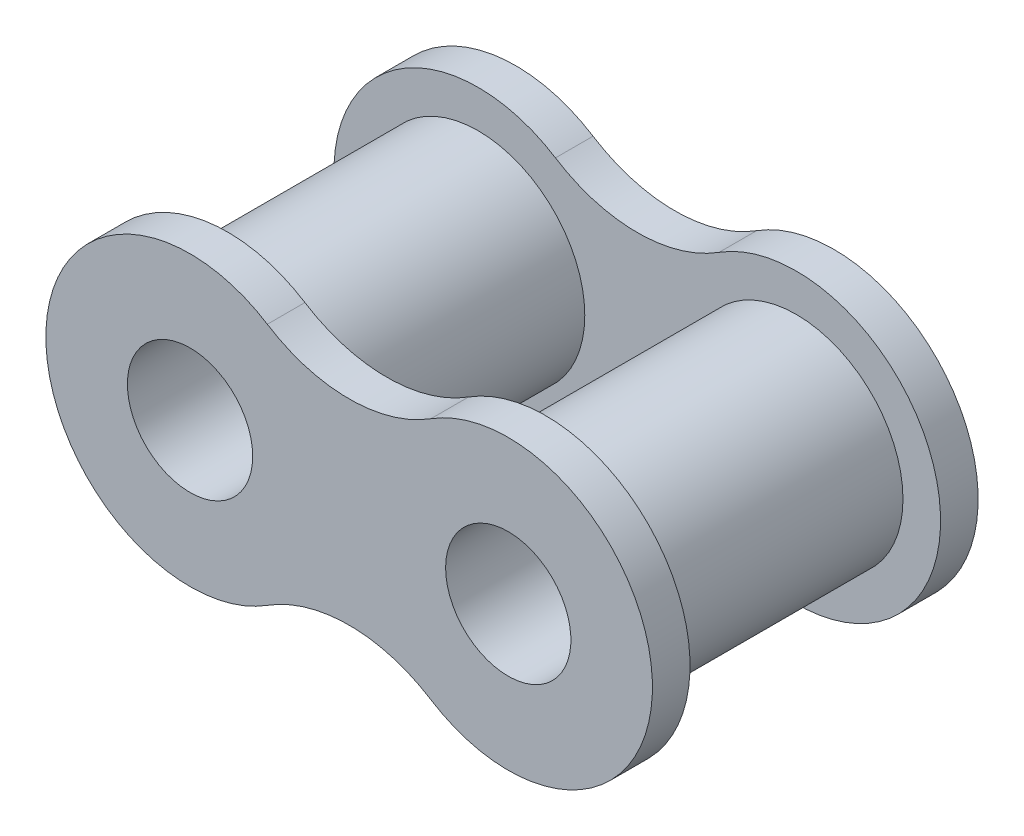
ISO-10303-21;
HEADER;
FILE_DESCRIPTION(('STEP AP214'),'2;1');
FILE_NAME('part.step','',(''),(''),'','','');
FILE_SCHEMA(('AUTOMOTIVE_DESIGN { 1 0 10303 214 1 1 1 1 }'));
ENDSEC;
DATA;
#1=APPLICATION_CONTEXT('core data for automotive mechanical design processes');
#2=APPLICATION_PROTOCOL_DEFINITION('international standard','automotive_design',2000,#1);
#3=PRODUCT_CONTEXT('',#1,'mechanical');
#4=PRODUCT('Part','Part','',(#3));
#5=PRODUCT_RELATED_PRODUCT_CATEGORY('part','',(#4));
#6=PRODUCT_DEFINITION_FORMATION('','',#4);
#7=PRODUCT_DEFINITION_CONTEXT('part definition',#1,'design');
#8=PRODUCT_DEFINITION('design','',#6,#7);
#9=PRODUCT_DEFINITION_SHAPE('','',#8);
#10=(LENGTH_UNIT() NAMED_UNIT(*) SI_UNIT(.MILLI.,.METRE.));
#11=(NAMED_UNIT(*) PLANE_ANGLE_UNIT() SI_UNIT($,.RADIAN.));
#12=(NAMED_UNIT(*) SI_UNIT($,.STERADIAN.) SOLID_ANGLE_UNIT());
#13=UNCERTAINTY_MEASURE_WITH_UNIT(LENGTH_MEASURE(1.E-05),#10,'distance_accuracy_value','');
#14=(GEOMETRIC_REPRESENTATION_CONTEXT(3) GLOBAL_UNCERTAINTY_ASSIGNED_CONTEXT((#13)) GLOBAL_UNIT_ASSIGNED_CONTEXT((#10,
#11,#12)) REPRESENTATION_CONTEXT('',''));
#15=CARTESIAN_POINT('',(0.,0.,0.));
#16=DIRECTION('',(0.,0.,1.));
#17=DIRECTION('',(1.,0.,0.));
#18=AXIS2_PLACEMENT_3D('',#15,#16,#17);
#19=CARTESIAN_POINT('',(3.175,5.,-5.));
#20=DIRECTION('',(0.,0.,1.));
#21=DIRECTION('',(1.,0.,0.));
#22=AXIS2_PLACEMENT_3D('',#19,#20,#21);
#23=PLANE('',#22);
#24=CARTESIAN_POINT('',(0.,10.,-5.));
#25=DIRECTION('',(0.,0.,1.));
#26=DIRECTION('',(1.,0.,0.));
#27=AXIS2_PLACEMENT_3D('',#24,#25,#26);
#28=CIRCLE('',#27,6.09077983925077);
#29=CARTESIAN_POINT('',(-3.26499837951476,4.85827026848069,-5.));
#30=VERTEX_POINT('',#29);
#31=CARTESIAN_POINT('',(3.26499837951476,4.85827026848069,-5.));
#32=VERTEX_POINT('',#31);
#33=EDGE_CURVE('E159',#30,#32,#28,.T.);
#34=ORIENTED_EDGE('',*,*,#33,.F.);
#35=CARTESIAN_POINT('',(-6.35,0.,-5.));
#36=DIRECTION('',(0.,0.,1.));
#37=DIRECTION('',(1.,0.,0.));
#38=AXIS2_PLACEMENT_3D('',#35,#36,#37);
#39=CIRCLE('',#38,5.755);
#40=CARTESIAN_POINT('',(-3.26499837951476,-4.85827026848069,-5.));
#41=VERTEX_POINT('',#40);
#42=EDGE_CURVE('E164',#30,#41,#39,.T.);
#43=ORIENTED_EDGE('',*,*,#42,.T.);
#44=CARTESIAN_POINT('',(0.,-10.,-5.));
#45=DIRECTION('',(0.,0.,-1.));
#46=DIRECTION('',(-1.,0.,0.));
#47=AXIS2_PLACEMENT_3D('',#44,#45,#46);
#48=CIRCLE('',#47,6.09077983925077);
#49=CARTESIAN_POINT('',(3.26499837951476,-4.85827026848069,-5.));
#50=VERTEX_POINT('',#49);
#51=EDGE_CURVE('E175',#41,#50,#48,.T.);
#52=ORIENTED_EDGE('',*,*,#51,.T.);
#53=CARTESIAN_POINT('',(6.35,0.,-5.));
#54=DIRECTION('',(0.,0.,-1.));
#55=DIRECTION('',(-1.,0.,0.));
#56=AXIS2_PLACEMENT_3D('',#53,#54,#55);
#57=CIRCLE('',#56,5.755);
#58=EDGE_CURVE('E172',#32,#50,#57,.T.);
#59=ORIENTED_EDGE('',*,*,#58,.F.);
#60=EDGE_LOOP('',(#34,#43,#52,#59));
#61=FACE_BOUND('',#60,.T.);
#62=CARTESIAN_POINT('',(6.35,0.,-5.));
#63=DIRECTION('',(0.,0.,1.));
#64=DIRECTION('',(1.,0.,0.));
#65=AXIS2_PLACEMENT_3D('',#62,#63,#64);
#66=CIRCLE('',#65,4.255);
#67=CARTESIAN_POINT('',(10.605,0.,-5.));
#68=VERTEX_POINT('',#67);
#69=EDGE_CURVE('E11',#68,#68,#66,.F.);
#70=ORIENTED_EDGE('',*,*,#69,.T.);
#71=EDGE_LOOP('',(#70));
#72=FACE_BOUND('',#71,.T.);
#73=CARTESIAN_POINT('',(-6.35,0.,-5.));
#74=DIRECTION('',(0.,0.,1.));
#75=DIRECTION('',(1.,0.,0.));
#76=AXIS2_PLACEMENT_3D('',#73,#74,#75);
#77=CIRCLE('',#76,4.255);
#78=CARTESIAN_POINT('',(-2.095,0.,-5.));
#79=VERTEX_POINT('',#78);
#80=EDGE_CURVE('E156',#79,#79,#77,.T.);
#81=ORIENTED_EDGE('',*,*,#80,.F.);
#82=EDGE_LOOP('',(#81));
#83=FACE_BOUND('',#82,.T.);
#84=ADVANCED_FACE('F36',(#61,#72,#83),#23,.T.);
#85=CARTESIAN_POINT('',(6.35,0.,5.));
#86=DIRECTION('',(0.,0.,-1.));
#87=DIRECTION('',(-1.,0.,0.));
#88=AXIS2_PLACEMENT_3D('',#85,#86,#87);
#89=CYLINDRICAL_SURFACE('',#88,4.255);
#90=CARTESIAN_POINT('',(6.35,0.,5.));
#91=DIRECTION('',(0.,0.,-1.));
#92=DIRECTION('',(-1.,0.,0.));
#93=AXIS2_PLACEMENT_3D('',#90,#91,#92);
#94=CIRCLE('',#93,4.255);
#95=CARTESIAN_POINT('',(2.095,0.,5.));
#96=VERTEX_POINT('',#95);
#97=EDGE_CURVE('E118',#96,#96,#94,.F.);
#98=ORIENTED_EDGE('',*,*,#97,.F.);
#99=EDGE_LOOP('',(#98));
#100=FACE_BOUND('',#99,.T.);
#101=ORIENTED_EDGE('',*,*,#69,.F.);
#102=EDGE_LOOP('',(#101));
#103=FACE_BOUND('',#102,.T.);
#104=ADVANCED_FACE('F38',(#100,#103),#89,.T.);
#105=CARTESIAN_POINT('',(0.,10.,-6.5));
#106=DIRECTION('',(0.,0.,1.));
#107=DIRECTION('',(1.,0.,0.));
#108=AXIS2_PLACEMENT_3D('',#105,#106,#107);
#109=CYLINDRICAL_SURFACE('',#108,6.09077983925077);
#110=ORIENTED_EDGE('',*,*,#33,.T.);
#111=DIRECTION('',(0.,0.,1.));
#112=VECTOR('',#111,1.);
#113=CARTESIAN_POINT('',(3.26499837951476,4.85827026848069,-6.5));
#114=LINE('',#113,#112);
#115=CARTESIAN_POINT('',(3.26499837951476,4.85827026848069,-6.5));
#116=VERTEX_POINT('',#115);
#117=EDGE_CURVE('E45',#116,#32,#114,.T.);
#118=ORIENTED_EDGE('',*,*,#117,.F.);
#119=CARTESIAN_POINT('',(0.,10.,-6.5));
#120=DIRECTION('',(0.,0.,1.));
#121=DIRECTION('',(1.,0.,0.));
#122=AXIS2_PLACEMENT_3D('',#119,#120,#121);
#123=CIRCLE('',#122,6.09077983925077);
#124=CARTESIAN_POINT('',(-3.26499837951476,4.85827026848069,-6.5));
#125=VERTEX_POINT('',#124);
#126=EDGE_CURVE('E162',#125,#116,#123,.T.);
#127=ORIENTED_EDGE('',*,*,#126,.F.);
#128=DIRECTION('',(0.,0.,1.));
#129=VECTOR('',#128,1.);
#130=CARTESIAN_POINT('',(-3.26499837951476,4.85827026848069,-6.5));
#131=LINE('',#130,#129);
#132=EDGE_CURVE('E53',#125,#30,#131,.T.);
#133=ORIENTED_EDGE('',*,*,#132,.T.);
#134=EDGE_LOOP('',(#110,#118,#127,#133));
#135=FACE_BOUND('',#134,.T.);
#136=ADVANCED_FACE('F185',(#135),#109,.F.);
#137=CARTESIAN_POINT('',(6.35,0.,-6.5));
#138=DIRECTION('',(0.,0.,1.));
#139=DIRECTION('',(1.,0.,0.));
#140=AXIS2_PLACEMENT_3D('',#137,#138,#139);
#141=CYLINDRICAL_SURFACE('',#140,5.755);
#142=ORIENTED_EDGE('',*,*,#58,.T.);
#143=DIRECTION('',(0.,0.,1.));
#144=VECTOR('',#143,1.);
#145=CARTESIAN_POINT('',(3.26499837951476,-4.85827026848069,-6.5));
#146=LINE('',#145,#144);
#147=CARTESIAN_POINT('',(3.26499837951476,-4.85827026848069,-6.5));
#148=VERTEX_POINT('',#147);
#149=EDGE_CURVE('E182',#148,#50,#146,.T.);
#150=ORIENTED_EDGE('',*,*,#149,.F.);
#151=CARTESIAN_POINT('',(6.35,0.,-6.5));
#152=DIRECTION('',(0.,0.,-1.));
#153=DIRECTION('',(-1.,0.,0.));
#154=AXIS2_PLACEMENT_3D('',#151,#152,#153);
#155=CIRCLE('',#154,5.755);
#156=EDGE_CURVE('E80',#116,#148,#155,.T.);
#157=ORIENTED_EDGE('',*,*,#156,.F.);
#158=ORIENTED_EDGE('',*,*,#117,.T.);
#159=EDGE_LOOP('',(#142,#150,#157,#158));
#160=FACE_BOUND('',#159,.T.);
#161=ADVANCED_FACE('F184',(#160),#141,.T.);
#162=CARTESIAN_POINT('',(0.,-10.,-6.5));
#163=DIRECTION('',(0.,0.,1.));
#164=DIRECTION('',(1.,0.,0.));
#165=AXIS2_PLACEMENT_3D('',#162,#163,#164);
#166=CYLINDRICAL_SURFACE('',#165,6.09077983925077);
#167=ORIENTED_EDGE('',*,*,#51,.F.);
#168=DIRECTION('',(0.,0.,1.));
#169=VECTOR('',#168,1.);
#170=CARTESIAN_POINT('',(-3.26499837951476,-4.85827026848069,-6.5));
#171=LINE('',#170,#169);
#172=CARTESIAN_POINT('',(-3.26499837951476,-4.85827026848069,-6.5));
#173=VERTEX_POINT('',#172);
#174=EDGE_CURVE('E68',#173,#41,#171,.T.);
#175=ORIENTED_EDGE('',*,*,#174,.F.);
#176=CARTESIAN_POINT('',(0.,-10.,-6.5));
#177=DIRECTION('',(0.,0.,-1.));
#178=DIRECTION('',(-1.,0.,0.));
#179=AXIS2_PLACEMENT_3D('',#176,#177,#178);
#180=CIRCLE('',#179,6.09077983925077);
#181=EDGE_CURVE('E166',#173,#148,#180,.T.);
#182=ORIENTED_EDGE('',*,*,#181,.T.);
#183=ORIENTED_EDGE('',*,*,#149,.T.);
#184=EDGE_LOOP('',(#167,#175,#182,#183));
#185=FACE_BOUND('',#184,.T.);
#186=ADVANCED_FACE('F191',(#185),#166,.F.);
#187=CARTESIAN_POINT('',(-6.35,0.,-6.5));
#188=DIRECTION('',(0.,0.,1.));
#189=DIRECTION('',(1.,0.,0.));
#190=AXIS2_PLACEMENT_3D('',#187,#188,#189);
#191=CYLINDRICAL_SURFACE('',#190,5.755);
#192=ORIENTED_EDGE('',*,*,#42,.F.);
#193=ORIENTED_EDGE('',*,*,#132,.F.);
#194=CARTESIAN_POINT('',(-6.35,0.,-6.5));
#195=DIRECTION('',(0.,0.,1.));
#196=DIRECTION('',(1.,0.,0.));
#197=AXIS2_PLACEMENT_3D('',#194,#195,#196);
#198=CIRCLE('',#197,5.755);
#199=EDGE_CURVE('E169',#125,#173,#198,.T.);
#200=ORIENTED_EDGE('',*,*,#199,.T.);
#201=ORIENTED_EDGE('',*,*,#174,.T.);
#202=EDGE_LOOP('',(#192,#193,#200,#201));
#203=FACE_BOUND('',#202,.T.);
#204=ADVANCED_FACE('F188',(#203),#191,.T.);
#205=CARTESIAN_POINT('',(3.175,5.,-6.5));
#206=DIRECTION('',(0.,0.,1.));
#207=DIRECTION('',(1.,0.,0.));
#208=AXIS2_PLACEMENT_3D('',#205,#206,#207);
#209=PLANE('',#208);
#210=CARTESIAN_POINT('',(6.35,0.,-6.5));
#211=DIRECTION('',(0.,0.,1.));
#212=DIRECTION('',(-1.,0.,0.));
#213=AXIS2_PLACEMENT_3D('',#210,#211,#212);
#214=CIRCLE('',#213,2.5);
#215=CARTESIAN_POINT('',(3.85,0.,-6.5));
#216=VERTEX_POINT('',#215);
#217=EDGE_CURVE('E243',#216,#216,#214,.T.);
#218=ORIENTED_EDGE('',*,*,#217,.T.);
#219=EDGE_LOOP('',(#218));
#220=FACE_BOUND('',#219,.T.);
#221=CARTESIAN_POINT('',(-6.35,0.,-6.5));
#222=DIRECTION('',(0.,0.,1.));
#223=DIRECTION('',(1.,0.,0.));
#224=AXIS2_PLACEMENT_3D('',#221,#222,#223);
#225=CIRCLE('',#224,2.5);
#226=CARTESIAN_POINT('',(-3.85,0.,-6.5));
#227=VERTEX_POINT('',#226);
#228=EDGE_CURVE('E138',#227,#227,#225,.T.);
#229=ORIENTED_EDGE('',*,*,#228,.T.);
#230=EDGE_LOOP('',(#229));
#231=FACE_BOUND('',#230,.T.);
#232=ORIENTED_EDGE('',*,*,#126,.T.);
#233=ORIENTED_EDGE('',*,*,#156,.T.);
#234=ORIENTED_EDGE('',*,*,#181,.F.);
#235=ORIENTED_EDGE('',*,*,#199,.F.);
#236=EDGE_LOOP('',(#232,#233,#234,#235));
#237=FACE_BOUND('',#236,.T.);
#238=ADVANCED_FACE('F190',(#220,#231,#237),#209,.F.);
#239=CARTESIAN_POINT('',(-6.35,0.,5.));
#240=DIRECTION('',(0.,0.,-1.));
#241=DIRECTION('',(-1.,0.,0.));
#242=AXIS2_PLACEMENT_3D('',#239,#240,#241);
#243=CYLINDRICAL_SURFACE('',#242,4.255);
#244=CARTESIAN_POINT('',(-6.35,0.,5.));
#245=DIRECTION('',(0.,0.,1.));
#246=DIRECTION('',(1.,0.,0.));
#247=AXIS2_PLACEMENT_3D('',#244,#245,#246);
#248=CIRCLE('',#247,4.255);
#249=CARTESIAN_POINT('',(-2.095,0.,5.));
#250=VERTEX_POINT('',#249);
#251=EDGE_CURVE('E155',#250,#250,#248,.T.);
#252=ORIENTED_EDGE('',*,*,#251,.F.);
#253=EDGE_LOOP('',(#252));
#254=FACE_BOUND('',#253,.T.);
#255=ORIENTED_EDGE('',*,*,#80,.T.);
#256=EDGE_LOOP('',(#255));
#257=FACE_BOUND('',#256,.T.);
#258=ADVANCED_FACE('F197',(#254,#257),#243,.T.);
#259=CARTESIAN_POINT('',(3.175,5.,5.));
#260=DIRECTION('',(0.,0.,-1.));
#261=DIRECTION('',(1.,0.,0.));
#262=AXIS2_PLACEMENT_3D('',#259,#260,#261);
#263=PLANE('',#262);
#264=ORIENTED_EDGE('',*,*,#97,.T.);
#265=EDGE_LOOP('',(#264));
#266=FACE_BOUND('',#265,.T.);
#267=CARTESIAN_POINT('',(0.,10.,5.));
#268=DIRECTION('',(0.,0.,1.));
#269=DIRECTION('',(1.,0.,0.));
#270=AXIS2_PLACEMENT_3D('',#267,#268,#269);
#271=CIRCLE('',#270,6.09077983925077);
#272=CARTESIAN_POINT('',(-3.26499837951476,4.85827026848069,5.));
#273=VERTEX_POINT('',#272);
#274=CARTESIAN_POINT('',(3.26499837951476,4.85827026848069,5.));
#275=VERTEX_POINT('',#274);
#276=EDGE_CURVE('E115',#273,#275,#271,.T.);
#277=ORIENTED_EDGE('',*,*,#276,.T.);
#278=CARTESIAN_POINT('',(6.35,0.,5.));
#279=DIRECTION('',(0.,0.,-1.));
#280=DIRECTION('',(-1.,0.,0.));
#281=AXIS2_PLACEMENT_3D('',#278,#279,#280);
#282=CIRCLE('',#281,5.755);
#283=CARTESIAN_POINT('',(3.26499837951476,-4.85827026848069,5.));
#284=VERTEX_POINT('',#283);
#285=EDGE_CURVE('E132',#275,#284,#282,.T.);
#286=ORIENTED_EDGE('',*,*,#285,.T.);
#287=CARTESIAN_POINT('',(0.,-10.,5.));
#288=DIRECTION('',(0.,0.,-1.));
#289=DIRECTION('',(-1.,0.,0.));
#290=AXIS2_PLACEMENT_3D('',#287,#288,#289);
#291=CIRCLE('',#290,6.09077983925077);
#292=CARTESIAN_POINT('',(-3.26499837951476,-4.85827026848069,5.));
#293=VERTEX_POINT('',#292);
#294=EDGE_CURVE('E135',#293,#284,#291,.T.);
#295=ORIENTED_EDGE('',*,*,#294,.F.);
#296=CARTESIAN_POINT('',(-6.35,0.,5.));
#297=DIRECTION('',(0.,0.,1.));
#298=DIRECTION('',(1.,0.,0.));
#299=AXIS2_PLACEMENT_3D('',#296,#297,#298);
#300=CIRCLE('',#299,5.755);
#301=EDGE_CURVE('E145',#273,#293,#300,.T.);
#302=ORIENTED_EDGE('',*,*,#301,.F.);
#303=EDGE_LOOP('',(#277,#286,#295,#302));
#304=FACE_BOUND('',#303,.T.);
#305=ORIENTED_EDGE('',*,*,#251,.T.);
#306=EDGE_LOOP('',(#305));
#307=FACE_BOUND('',#306,.T.);
#308=ADVANCED_FACE('F211',(#266,#304,#307),#263,.T.);
#309=CARTESIAN_POINT('',(0.,10.,6.5));
#310=DIRECTION('',(0.,0.,-1.));
#311=DIRECTION('',(-1.,0.,0.));
#312=AXIS2_PLACEMENT_3D('',#309,#310,#311);
#313=CYLINDRICAL_SURFACE('',#312,6.09077983925077);
#314=ORIENTED_EDGE('',*,*,#276,.F.);
#315=DIRECTION('',(0.,0.,-1.));
#316=VECTOR('',#315,1.);
#317=CARTESIAN_POINT('',(-3.26499837951476,4.85827026848069,6.5));
#318=LINE('',#317,#316);
#319=CARTESIAN_POINT('',(-3.26499837951476,4.85827026848069,6.5));
#320=VERTEX_POINT('',#319);
#321=EDGE_CURVE('E108',#320,#273,#318,.T.);
#322=ORIENTED_EDGE('',*,*,#321,.F.);
#323=CARTESIAN_POINT('',(0.,10.,6.5));
#324=DIRECTION('',(0.,0.,1.));
#325=DIRECTION('',(1.,0.,0.));
#326=AXIS2_PLACEMENT_3D('',#323,#324,#325);
#327=CIRCLE('',#326,6.09077983925077);
#328=CARTESIAN_POINT('',(3.26499837951476,4.85827026848069,6.5));
#329=VERTEX_POINT('',#328);
#330=EDGE_CURVE('E112',#320,#329,#327,.T.);
#331=ORIENTED_EDGE('',*,*,#330,.T.);
#332=DIRECTION('',(0.,0.,-1.));
#333=VECTOR('',#332,1.);
#334=CARTESIAN_POINT('',(3.26499837951476,4.85827026848069,6.5));
#335=LINE('',#334,#333);
#336=EDGE_CURVE('E143',#329,#275,#335,.T.);
#337=ORIENTED_EDGE('',*,*,#336,.T.);
#338=EDGE_LOOP('',(#314,#322,#331,#337));
#339=FACE_BOUND('',#338,.T.);
#340=ADVANCED_FACE('F110',(#339),#313,.F.);
#341=CARTESIAN_POINT('',(-6.35,0.,6.5));
#342=DIRECTION('',(0.,0.,-1.));
#343=DIRECTION('',(-1.,0.,0.));
#344=AXIS2_PLACEMENT_3D('',#341,#342,#343);
#345=CYLINDRICAL_SURFACE('',#344,5.755);
#346=ORIENTED_EDGE('',*,*,#301,.T.);
#347=DIRECTION('',(0.,0.,-1.));
#348=VECTOR('',#347,1.);
#349=CARTESIAN_POINT('',(-3.26499837951476,-4.85827026848069,6.5));
#350=LINE('',#349,#348);
#351=CARTESIAN_POINT('',(-3.26499837951476,-4.85827026848069,6.5));
#352=VERTEX_POINT('',#351);
#353=EDGE_CURVE('E119',#352,#293,#350,.T.);
#354=ORIENTED_EDGE('',*,*,#353,.F.);
#355=CARTESIAN_POINT('',(-6.35,0.,6.5));
#356=DIRECTION('',(0.,0.,1.));
#357=DIRECTION('',(1.,0.,0.));
#358=AXIS2_PLACEMENT_3D('',#355,#356,#357);
#359=CIRCLE('',#358,5.755);
#360=EDGE_CURVE('E122',#320,#352,#359,.T.);
#361=ORIENTED_EDGE('',*,*,#360,.F.);
#362=ORIENTED_EDGE('',*,*,#321,.T.);
#363=EDGE_LOOP('',(#346,#354,#361,#362));
#364=FACE_BOUND('',#363,.T.);
#365=ADVANCED_FACE('F123',(#364),#345,.T.);
#366=CARTESIAN_POINT('',(0.,-10.,6.5));
#367=DIRECTION('',(0.,0.,-1.));
#368=DIRECTION('',(-1.,0.,0.));
#369=AXIS2_PLACEMENT_3D('',#366,#367,#368);
#370=CYLINDRICAL_SURFACE('',#369,6.09077983925077);
#371=ORIENTED_EDGE('',*,*,#294,.T.);
#372=DIRECTION('',(0.,0.,-1.));
#373=VECTOR('',#372,1.);
#374=CARTESIAN_POINT('',(3.26499837951476,-4.85827026848069,6.5));
#375=LINE('',#374,#373);
#376=CARTESIAN_POINT('',(3.26499837951476,-4.85827026848069,6.5));
#377=VERTEX_POINT('',#376);
#378=EDGE_CURVE('E150',#377,#284,#375,.T.);
#379=ORIENTED_EDGE('',*,*,#378,.F.);
#380=CARTESIAN_POINT('',(0.,-10.,6.5));
#381=DIRECTION('',(0.,0.,-1.));
#382=DIRECTION('',(-1.,0.,0.));
#383=AXIS2_PLACEMENT_3D('',#380,#381,#382);
#384=CIRCLE('',#383,6.09077983925077);
#385=EDGE_CURVE('E127',#352,#377,#384,.T.);
#386=ORIENTED_EDGE('',*,*,#385,.F.);
#387=ORIENTED_EDGE('',*,*,#353,.T.);
#388=EDGE_LOOP('',(#371,#379,#386,#387));
#389=FACE_BOUND('',#388,.T.);
#390=ADVANCED_FACE('F217',(#389),#370,.F.);
#391=CARTESIAN_POINT('',(6.35,0.,6.5));
#392=DIRECTION('',(0.,0.,-1.));
#393=DIRECTION('',(-1.,0.,0.));
#394=AXIS2_PLACEMENT_3D('',#391,#392,#393);
#395=CYLINDRICAL_SURFACE('',#394,5.755);
#396=ORIENTED_EDGE('',*,*,#285,.F.);
#397=ORIENTED_EDGE('',*,*,#336,.F.);
#398=CARTESIAN_POINT('',(6.35,0.,6.5));
#399=DIRECTION('',(0.,0.,-1.));
#400=DIRECTION('',(-1.,0.,0.));
#401=AXIS2_PLACEMENT_3D('',#398,#399,#400);
#402=CIRCLE('',#401,5.755);
#403=EDGE_CURVE('E131',#329,#377,#402,.T.);
#404=ORIENTED_EDGE('',*,*,#403,.T.);
#405=ORIENTED_EDGE('',*,*,#378,.T.);
#406=EDGE_LOOP('',(#396,#397,#404,#405));
#407=FACE_BOUND('',#406,.T.);
#408=ADVANCED_FACE('F220',(#407),#395,.T.);
#409=CARTESIAN_POINT('',(3.175,5.,6.5));
#410=DIRECTION('',(0.,0.,-1.));
#411=DIRECTION('',(1.,0.,0.));
#412=AXIS2_PLACEMENT_3D('',#409,#410,#411);
#413=PLANE('',#412);
#414=CARTESIAN_POINT('',(6.35,0.,6.5));
#415=DIRECTION('',(0.,0.,1.));
#416=DIRECTION('',(-1.,0.,0.));
#417=AXIS2_PLACEMENT_3D('',#414,#415,#416);
#418=CIRCLE('',#417,2.5);
#419=CARTESIAN_POINT('',(3.85,0.,6.5));
#420=VERTEX_POINT('',#419);
#421=EDGE_CURVE('E246',#420,#420,#418,.T.);
#422=ORIENTED_EDGE('',*,*,#421,.F.);
#423=EDGE_LOOP('',(#422));
#424=FACE_BOUND('',#423,.T.);
#425=CARTESIAN_POINT('',(-6.35,0.,6.5));
#426=DIRECTION('',(0.,0.,1.));
#427=DIRECTION('',(1.,0.,0.));
#428=AXIS2_PLACEMENT_3D('',#425,#426,#427);
#429=CIRCLE('',#428,2.5);
#430=CARTESIAN_POINT('',(-3.85,0.,6.5));
#431=VERTEX_POINT('',#430);
#432=EDGE_CURVE('E248',#431,#431,#429,.T.);
#433=ORIENTED_EDGE('',*,*,#432,.F.);
#434=EDGE_LOOP('',(#433));
#435=FACE_BOUND('',#434,.T.);
#436=ORIENTED_EDGE('',*,*,#330,.F.);
#437=ORIENTED_EDGE('',*,*,#360,.T.);
#438=ORIENTED_EDGE('',*,*,#385,.T.);
#439=ORIENTED_EDGE('',*,*,#403,.F.);
#440=EDGE_LOOP('',(#436,#437,#438,#439));
#441=FACE_BOUND('',#440,.T.);
#442=ADVANCED_FACE('F129',(#424,#435,#441),#413,.F.);
#443=CARTESIAN_POINT('',(-6.35,0.,-6.5));
#444=DIRECTION('',(0.,0.,1.));
#445=DIRECTION('',(1.,0.,0.));
#446=AXIS2_PLACEMENT_3D('',#443,#444,#445);
#447=CYLINDRICAL_SURFACE('',#446,2.5);
#448=ORIENTED_EDGE('',*,*,#228,.F.);
#449=EDGE_LOOP('',(#448));
#450=FACE_BOUND('',#449,.T.);
#451=ORIENTED_EDGE('',*,*,#432,.T.);
#452=EDGE_LOOP('',(#451));
#453=FACE_BOUND('',#452,.T.);
#454=ADVANCED_FACE('F230',(#450,#453),#447,.F.);
#455=CARTESIAN_POINT('',(6.35,0.,-6.5));
#456=DIRECTION('',(0.,0.,1.));
#457=DIRECTION('',(1.,0.,0.));
#458=AXIS2_PLACEMENT_3D('',#455,#456,#457);
#459=CYLINDRICAL_SURFACE('',#458,2.5);
#460=ORIENTED_EDGE('',*,*,#217,.F.);
#461=EDGE_LOOP('',(#460));
#462=FACE_BOUND('',#461,.T.);
#463=ORIENTED_EDGE('',*,*,#421,.T.);
#464=EDGE_LOOP('',(#463));
#465=FACE_BOUND('',#464,.T.);
#466=ADVANCED_FACE('F234',(#462,#465),#459,.F.);
#467=CLOSED_SHELL('',(#84,#104,#136,#161,#186,#204,#238,#258,#308,#340,#365,#390,#408,#442,#454,#466));
#468=MANIFOLD_SOLID_BREP('B2',#467);
#469=ADVANCED_BREP_SHAPE_REPRESENTATION('',(#18,#468),#14);
#470=SHAPE_DEFINITION_REPRESENTATION(#9,#469);
ENDSEC;
END-ISO-10303-21;
